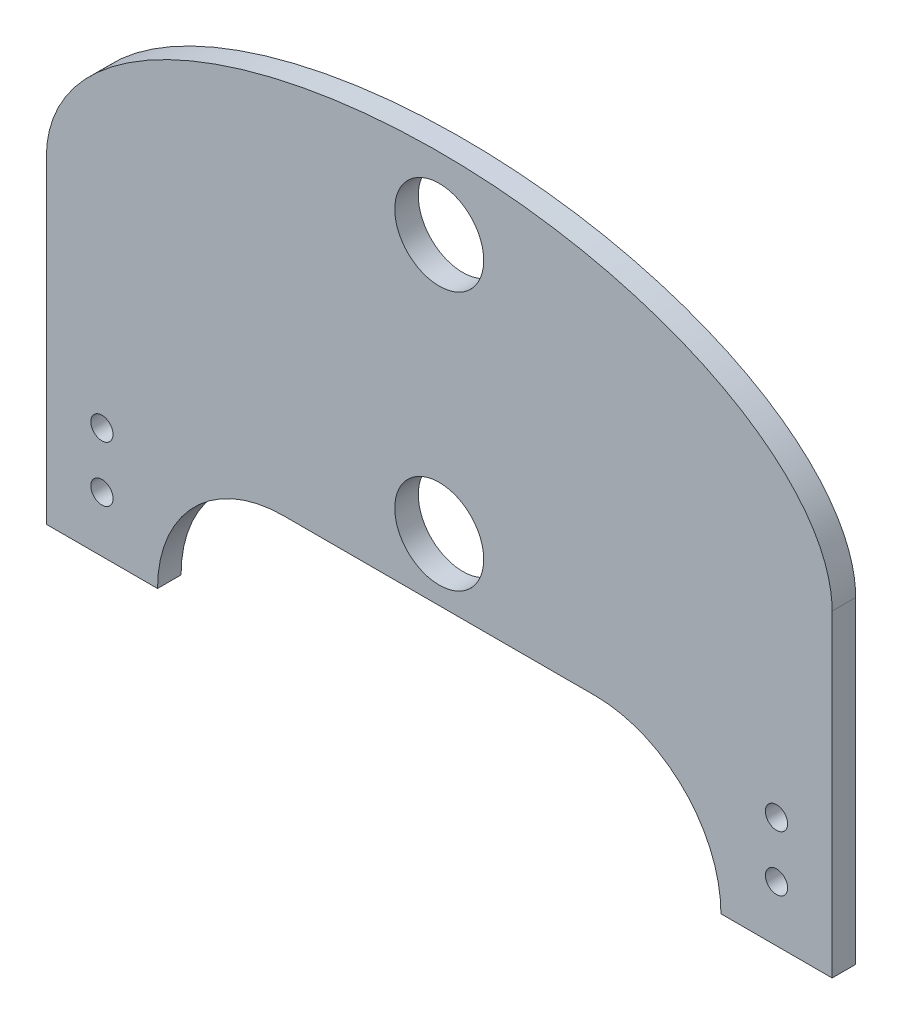
ISO-10303-21;
HEADER;
FILE_DESCRIPTION(('STEP AP214'),'2;1');
FILE_NAME('part.step','',(''),(''),'','','');
FILE_SCHEMA(('AUTOMOTIVE_DESIGN { 1 0 10303 214 1 1 1 1 }'));
ENDSEC;
DATA;
#1=APPLICATION_CONTEXT('core data for automotive mechanical design processes');
#2=APPLICATION_PROTOCOL_DEFINITION('international standard','automotive_design',2000,#1);
#3=PRODUCT_CONTEXT('',#1,'mechanical');
#4=PRODUCT('Part','Part','',(#3));
#5=PRODUCT_RELATED_PRODUCT_CATEGORY('part','',(#4));
#6=PRODUCT_DEFINITION_FORMATION('','',#4);
#7=PRODUCT_DEFINITION_CONTEXT('part definition',#1,'design');
#8=PRODUCT_DEFINITION('design','',#6,#7);
#9=PRODUCT_DEFINITION_SHAPE('','',#8);
#10=(LENGTH_UNIT() NAMED_UNIT(*) SI_UNIT(.MILLI.,.METRE.));
#11=(NAMED_UNIT(*) PLANE_ANGLE_UNIT() SI_UNIT($,.RADIAN.));
#12=(NAMED_UNIT(*) SI_UNIT($,.STERADIAN.) SOLID_ANGLE_UNIT());
#13=UNCERTAINTY_MEASURE_WITH_UNIT(LENGTH_MEASURE(1.E-05),#10,'distance_accuracy_value','');
#14=(GEOMETRIC_REPRESENTATION_CONTEXT(3) GLOBAL_UNCERTAINTY_ASSIGNED_CONTEXT((#13)) GLOBAL_UNIT_ASSIGNED_CONTEXT((#10,
#11,#12)) REPRESENTATION_CONTEXT('',''));
#15=CARTESIAN_POINT('',(0.,0.,0.));
#16=DIRECTION('',(0.,0.,1.));
#17=DIRECTION('',(1.,0.,0.));
#18=AXIS2_PLACEMENT_3D('',#15,#16,#17);
#19=CARTESIAN_POINT('',(0.,0.,3.175));
#20=DIRECTION('',(0.,0.,1.));
#21=DIRECTION('',(1.,0.,0.));
#22=AXIS2_PLACEMENT_3D('',#19,#20,#21);
#23=PLANE('',#22);
#24=CARTESIAN_POINT('',(7.5,7.5,3.175));
#25=DIRECTION('',(0.,0.,-1.));
#26=DIRECTION('',(-1.,0.,0.));
#27=AXIS2_PLACEMENT_3D('',#24,#25,#26);
#28=CIRCLE('',#27,1.5);
#29=CARTESIAN_POINT('',(6.,7.5,3.175));
#30=VERTEX_POINT('',#29);
#31=EDGE_CURVE('E232',#30,#30,#28,.T.);
#32=ORIENTED_EDGE('',*,*,#31,.T.);
#33=EDGE_LOOP('',(#32));
#34=FACE_BOUND('',#33,.T.);
#35=CARTESIAN_POINT('',(7.5,15.,3.175));
#36=DIRECTION('',(0.,0.,-1.));
#37=DIRECTION('',(-1.,0.,0.));
#38=AXIS2_PLACEMENT_3D('',#35,#36,#37);
#39=CIRCLE('',#38,1.5);
#40=CARTESIAN_POINT('',(6.,15.,3.175));
#41=VERTEX_POINT('',#40);
#42=EDGE_CURVE('E224',#41,#41,#39,.T.);
#43=ORIENTED_EDGE('',*,*,#42,.T.);
#44=EDGE_LOOP('',(#43));
#45=FACE_BOUND('',#44,.T.);
#46=CARTESIAN_POINT('',(98.5,15.,3.175));
#47=DIRECTION('',(0.,0.,-1.));
#48=DIRECTION('',(-1.,0.,0.));
#49=AXIS2_PLACEMENT_3D('',#46,#47,#48);
#50=CIRCLE('',#49,1.5);
#51=CARTESIAN_POINT('',(97.,15.,3.175));
#52=VERTEX_POINT('',#51);
#53=EDGE_CURVE('E215',#52,#52,#50,.T.);
#54=ORIENTED_EDGE('',*,*,#53,.T.);
#55=EDGE_LOOP('',(#54));
#56=FACE_BOUND('',#55,.T.);
#57=CARTESIAN_POINT('',(98.5,7.5,3.175));
#58=DIRECTION('',(0.,0.,-1.));
#59=DIRECTION('',(-1.,0.,0.));
#60=AXIS2_PLACEMENT_3D('',#57,#58,#59);
#61=CIRCLE('',#60,1.5);
#62=CARTESIAN_POINT('',(97.,7.5,3.175));
#63=VERTEX_POINT('',#62);
#64=EDGE_CURVE('E154',#63,#63,#61,.T.);
#65=ORIENTED_EDGE('',*,*,#64,.T.);
#66=EDGE_LOOP('',(#65));
#67=FACE_BOUND('',#66,.T.);
#68=CARTESIAN_POINT('',(53.,25.4,3.175));
#69=DIRECTION('',(0.,0.,1.));
#70=DIRECTION('',(1.,0.,0.));
#71=AXIS2_PLACEMENT_3D('',#68,#69,#70);
#72=CIRCLE('',#71,5.99999999999999);
#73=CARTESIAN_POINT('',(59.,25.4,3.175));
#74=VERTEX_POINT('',#73);
#75=EDGE_CURVE('E141',#74,#74,#72,.T.);
#76=ORIENTED_EDGE('',*,*,#75,.F.);
#77=EDGE_LOOP('',(#76));
#78=FACE_BOUND('',#77,.T.);
#79=CARTESIAN_POINT('',(53.,60.325,3.175));
#80=DIRECTION('',(0.,0.,1.));
#81=DIRECTION('',(1.,0.,0.));
#82=AXIS2_PLACEMENT_3D('',#79,#80,#81);
#83=CIRCLE('',#82,5.99999999999999);
#84=CARTESIAN_POINT('',(59.,60.325,3.175));
#85=VERTEX_POINT('',#84);
#86=EDGE_CURVE('E145',#85,#85,#83,.T.);
#87=ORIENTED_EDGE('',*,*,#86,.F.);
#88=EDGE_LOOP('',(#87));
#89=FACE_BOUND('',#88,.T.);
#90=CARTESIAN_POINT('',(53.,42.8625,3.175));
#91=DIRECTION('',(0.,0.,-1.));
#92=DIRECTION('',(-1.,0.,0.));
#93=AXIS2_PLACEMENT_3D('',#90,#91,#92);
#94=ELLIPSE('',#93,53.,27.1375);
#95=CARTESIAN_POINT('',(0.,42.8625,3.175));
#96=VERTEX_POINT('',#95);
#97=CARTESIAN_POINT('',(106.,42.8625,3.175));
#98=VERTEX_POINT('',#97);
#99=EDGE_CURVE('E203',#96,#98,#94,.T.);
#100=ORIENTED_EDGE('',*,*,#99,.F.);
#101=DIRECTION('',(0.,1.,0.));
#102=VECTOR('',#101,1.);
#103=CARTESIAN_POINT('',(0.,0.,3.175));
#104=LINE('',#103,#102);
#105=CARTESIAN_POINT('',(0.,0.,3.175));
#106=VERTEX_POINT('',#105);
#107=EDGE_CURVE('E134',#106,#96,#104,.T.);
#108=ORIENTED_EDGE('',*,*,#107,.F.);
#109=DIRECTION('',(1.,0.,0.));
#110=VECTOR('',#109,1.);
#111=CARTESIAN_POINT('',(0.,0.,3.175));
#112=LINE('',#111,#110);
#113=CARTESIAN_POINT('',(15.,0.,3.175));
#114=VERTEX_POINT('',#113);
#115=EDGE_CURVE('E66',#106,#114,#112,.T.);
#116=ORIENTED_EDGE('',*,*,#115,.T.);
#117=CARTESIAN_POINT('',(32.,0.,3.175));
#118=DIRECTION('',(0.,0.,1.));
#119=DIRECTION('',(1.,0.,0.));
#120=AXIS2_PLACEMENT_3D('',#117,#118,#119);
#121=CIRCLE('',#120,17.);
#122=CARTESIAN_POINT('',(32.,17.,3.175));
#123=VERTEX_POINT('',#122);
#124=EDGE_CURVE('E180',#123,#114,#121,.T.);
#125=ORIENTED_EDGE('',*,*,#124,.F.);
#126=DIRECTION('',(1.,0.,0.));
#127=VECTOR('',#126,1.);
#128=CARTESIAN_POINT('',(0.,17.,3.175));
#129=LINE('',#128,#127);
#130=CARTESIAN_POINT('',(74.,17.,3.175));
#131=VERTEX_POINT('',#130);
#132=EDGE_CURVE('E247',#123,#131,#129,.T.);
#133=ORIENTED_EDGE('',*,*,#132,.T.);
#134=CARTESIAN_POINT('',(74.,0.,3.175));
#135=DIRECTION('',(0.,0.,1.));
#136=DIRECTION('',(1.,0.,0.));
#137=AXIS2_PLACEMENT_3D('',#134,#135,#136);
#138=CIRCLE('',#137,17.);
#139=CARTESIAN_POINT('',(91.,0.,3.175));
#140=VERTEX_POINT('',#139);
#141=EDGE_CURVE('E116',#140,#131,#138,.T.);
#142=ORIENTED_EDGE('',*,*,#141,.F.);
#143=CARTESIAN_POINT('',(106.,0.,3.175));
#144=VERTEX_POINT('',#143);
#145=EDGE_CURVE('E110',#140,#144,#112,.T.);
#146=ORIENTED_EDGE('',*,*,#145,.T.);
#147=DIRECTION('',(0.,1.,0.));
#148=VECTOR('',#147,1.);
#149=CARTESIAN_POINT('',(106.,0.,3.175));
#150=LINE('',#149,#148);
#151=EDGE_CURVE('E114',#144,#98,#150,.T.);
#152=ORIENTED_EDGE('',*,*,#151,.T.);
#153=EDGE_LOOP('',(#100,#108,#116,#125,#133,#142,#146,#152));
#154=FACE_BOUND('',#153,.T.);
#155=ADVANCED_FACE('F41',(#34,#45,#56,#67,#78,#89,#154),#23,.T.);
#156=CARTESIAN_POINT('',(0.,0.,0.));
#157=DIRECTION('',(0.,0.,1.));
#158=DIRECTION('',(1.,0.,0.));
#159=AXIS2_PLACEMENT_3D('',#156,#157,#158);
#160=PLANE('',#159);
#161=CARTESIAN_POINT('',(7.5,7.5,0.));
#162=DIRECTION('',(0.,0.,-1.));
#163=DIRECTION('',(-1.,0.,0.));
#164=AXIS2_PLACEMENT_3D('',#161,#162,#163);
#165=CIRCLE('',#164,1.5);
#166=CARTESIAN_POINT('',(6.,7.5,0.));
#167=VERTEX_POINT('',#166);
#168=EDGE_CURVE('E214',#167,#167,#165,.T.);
#169=ORIENTED_EDGE('',*,*,#168,.F.);
#170=EDGE_LOOP('',(#169));
#171=FACE_BOUND('',#170,.T.);
#172=CARTESIAN_POINT('',(7.5,15.,0.));
#173=DIRECTION('',(0.,0.,-1.));
#174=DIRECTION('',(-1.,0.,0.));
#175=AXIS2_PLACEMENT_3D('',#172,#173,#174);
#176=CIRCLE('',#175,1.5);
#177=CARTESIAN_POINT('',(6.,15.,0.));
#178=VERTEX_POINT('',#177);
#179=EDGE_CURVE('E228',#178,#178,#176,.T.);
#180=ORIENTED_EDGE('',*,*,#179,.F.);
#181=EDGE_LOOP('',(#180));
#182=FACE_BOUND('',#181,.T.);
#183=CARTESIAN_POINT('',(98.5,15.,0.));
#184=DIRECTION('',(0.,0.,-1.));
#185=DIRECTION('',(-1.,0.,0.));
#186=AXIS2_PLACEMENT_3D('',#183,#184,#185);
#187=CIRCLE('',#186,1.5);
#188=CARTESIAN_POINT('',(97.,15.,0.));
#189=VERTEX_POINT('',#188);
#190=EDGE_CURVE('E220',#189,#189,#187,.T.);
#191=ORIENTED_EDGE('',*,*,#190,.F.);
#192=EDGE_LOOP('',(#191));
#193=FACE_BOUND('',#192,.T.);
#194=CARTESIAN_POINT('',(98.5,7.5,0.));
#195=DIRECTION('',(0.,0.,-1.));
#196=DIRECTION('',(-1.,0.,0.));
#197=AXIS2_PLACEMENT_3D('',#194,#195,#196);
#198=CIRCLE('',#197,1.5);
#199=CARTESIAN_POINT('',(97.,7.5,0.));
#200=VERTEX_POINT('',#199);
#201=EDGE_CURVE('E219',#200,#200,#198,.T.);
#202=ORIENTED_EDGE('',*,*,#201,.F.);
#203=EDGE_LOOP('',(#202));
#204=FACE_BOUND('',#203,.T.);
#205=CARTESIAN_POINT('',(53.,25.4,0.));
#206=DIRECTION('',(0.,0.,1.));
#207=DIRECTION('',(1.,0.,0.));
#208=AXIS2_PLACEMENT_3D('',#205,#206,#207);
#209=CIRCLE('',#208,5.99999999999999);
#210=CARTESIAN_POINT('',(59.,25.4,0.));
#211=VERTEX_POINT('',#210);
#212=EDGE_CURVE('E172',#211,#211,#209,.T.);
#213=ORIENTED_EDGE('',*,*,#212,.T.);
#214=EDGE_LOOP('',(#213));
#215=FACE_BOUND('',#214,.T.);
#216=CARTESIAN_POINT('',(53.,60.325,0.));
#217=DIRECTION('',(0.,0.,1.));
#218=DIRECTION('',(1.,0.,0.));
#219=AXIS2_PLACEMENT_3D('',#216,#217,#218);
#220=CIRCLE('',#219,5.99999999999999);
#221=CARTESIAN_POINT('',(59.,60.325,0.));
#222=VERTEX_POINT('',#221);
#223=EDGE_CURVE('E176',#222,#222,#220,.T.);
#224=ORIENTED_EDGE('',*,*,#223,.T.);
#225=EDGE_LOOP('',(#224));
#226=FACE_BOUND('',#225,.T.);
#227=DIRECTION('',(0.,1.,0.));
#228=VECTOR('',#227,1.);
#229=CARTESIAN_POINT('',(0.,0.,0.));
#230=LINE('',#229,#228);
#231=CARTESIAN_POINT('',(0.,0.,0.));
#232=VERTEX_POINT('',#231);
#233=CARTESIAN_POINT('',(0.,42.8625,0.));
#234=VERTEX_POINT('',#233);
#235=EDGE_CURVE('E168',#232,#234,#230,.T.);
#236=ORIENTED_EDGE('',*,*,#235,.T.);
#237=CARTESIAN_POINT('',(53.,42.8625,0.));
#238=DIRECTION('',(0.,0.,-1.));
#239=DIRECTION('',(-1.,0.,0.));
#240=AXIS2_PLACEMENT_3D('',#237,#238,#239);
#241=ELLIPSE('',#240,53.,27.1375);
#242=CARTESIAN_POINT('',(106.,42.8625,0.));
#243=VERTEX_POINT('',#242);
#244=EDGE_CURVE('E196',#234,#243,#241,.T.);
#245=ORIENTED_EDGE('',*,*,#244,.T.);
#246=DIRECTION('',(0.,1.,0.));
#247=VECTOR('',#246,1.);
#248=CARTESIAN_POINT('',(106.,0.,0.));
#249=LINE('',#248,#247);
#250=CARTESIAN_POINT('',(106.,0.,0.));
#251=VERTEX_POINT('',#250);
#252=EDGE_CURVE('E164',#251,#243,#249,.T.);
#253=ORIENTED_EDGE('',*,*,#252,.F.);
#254=DIRECTION('',(1.,0.,0.));
#255=VECTOR('',#254,1.);
#256=CARTESIAN_POINT('',(0.,0.,0.));
#257=LINE('',#256,#255);
#258=CARTESIAN_POINT('',(91.,0.,0.));
#259=VERTEX_POINT('',#258);
#260=EDGE_CURVE('E124',#259,#251,#257,.T.);
#261=ORIENTED_EDGE('',*,*,#260,.F.);
#262=CARTESIAN_POINT('',(74.,0.,0.));
#263=DIRECTION('',(0.,0.,1.));
#264=DIRECTION('',(1.,0.,0.));
#265=AXIS2_PLACEMENT_3D('',#262,#263,#264);
#266=CIRCLE('',#265,17.);
#267=CARTESIAN_POINT('',(74.,17.,0.));
#268=VERTEX_POINT('',#267);
#269=EDGE_CURVE('E158',#259,#268,#266,.T.);
#270=ORIENTED_EDGE('',*,*,#269,.T.);
#271=DIRECTION('',(1.,0.,0.));
#272=VECTOR('',#271,1.);
#273=CARTESIAN_POINT('',(0.,17.,0.));
#274=LINE('',#273,#272);
#275=CARTESIAN_POINT('',(32.,17.,0.));
#276=VERTEX_POINT('',#275);
#277=EDGE_CURVE('E153',#276,#268,#274,.T.);
#278=ORIENTED_EDGE('',*,*,#277,.F.);
#279=CARTESIAN_POINT('',(32.,0.,0.));
#280=DIRECTION('',(0.,0.,1.));
#281=DIRECTION('',(1.,0.,0.));
#282=AXIS2_PLACEMENT_3D('',#279,#280,#281);
#283=CIRCLE('',#282,17.);
#284=CARTESIAN_POINT('',(15.,0.,0.));
#285=VERTEX_POINT('',#284);
#286=EDGE_CURVE('E149',#276,#285,#283,.T.);
#287=ORIENTED_EDGE('',*,*,#286,.T.);
#288=EDGE_CURVE('E165',#232,#285,#257,.T.);
#289=ORIENTED_EDGE('',*,*,#288,.F.);
#290=EDGE_LOOP('',(#236,#245,#253,#261,#270,#278,#287,#289));
#291=FACE_BOUND('',#290,.T.);
#292=ADVANCED_FACE('F195',(#171,#182,#193,#204,#215,#226,#291),#160,.F.);
#293=CARTESIAN_POINT('',(0.,0.,3.175));
#294=DIRECTION('',(-1.,0.,0.));
#295=DIRECTION('',(0.,0.,1.));
#296=AXIS2_PLACEMENT_3D('',#293,#294,#295);
#297=PLANE('',#296);
#298=ORIENTED_EDGE('',*,*,#107,.T.);
#299=DIRECTION('',(0.,0.,-1.));
#300=VECTOR('',#299,1.);
#301=CARTESIAN_POINT('',(0.,42.8625,3.175));
#302=LINE('',#301,#300);
#303=EDGE_CURVE('E204',#96,#234,#302,.T.);
#304=ORIENTED_EDGE('',*,*,#303,.T.);
#305=ORIENTED_EDGE('',*,*,#235,.F.);
#306=DIRECTION('',(0.,0.,-1.));
#307=VECTOR('',#306,1.);
#308=CARTESIAN_POINT('',(0.,0.,3.175));
#309=LINE('',#308,#307);
#310=EDGE_CURVE('E130',#106,#232,#309,.T.);
#311=ORIENTED_EDGE('',*,*,#310,.F.);
#312=EDGE_LOOP('',(#298,#304,#305,#311));
#313=FACE_BOUND('',#312,.T.);
#314=ADVANCED_FACE('F258',(#313),#297,.T.);
#315=CARTESIAN_POINT('',(106.,0.,3.175));
#316=DIRECTION('',(-1.,0.,0.));
#317=DIRECTION('',(0.,0.,1.));
#318=AXIS2_PLACEMENT_3D('',#315,#316,#317);
#319=PLANE('',#318);
#320=DIRECTION('',(0.,0.,-1.));
#321=VECTOR('',#320,1.);
#322=CARTESIAN_POINT('',(106.,42.8625,3.175));
#323=LINE('',#322,#321);
#324=EDGE_CURVE('E57',#98,#243,#323,.T.);
#325=ORIENTED_EDGE('',*,*,#324,.F.);
#326=ORIENTED_EDGE('',*,*,#151,.F.);
#327=DIRECTION('',(0.,0.,-1.));
#328=VECTOR('',#327,1.);
#329=CARTESIAN_POINT('',(106.,0.,3.175));
#330=LINE('',#329,#328);
#331=EDGE_CURVE('E121',#144,#251,#330,.T.);
#332=ORIENTED_EDGE('',*,*,#331,.T.);
#333=ORIENTED_EDGE('',*,*,#252,.T.);
#334=EDGE_LOOP('',(#325,#326,#332,#333));
#335=FACE_BOUND('',#334,.T.);
#336=ADVANCED_FACE('F132',(#335),#319,.F.);
#337=CARTESIAN_POINT('',(32.,0.,3.175));
#338=DIRECTION('',(0.,0.,-1.));
#339=DIRECTION('',(-1.,0.,0.));
#340=AXIS2_PLACEMENT_3D('',#337,#338,#339);
#341=CYLINDRICAL_SURFACE('',#340,17.);
#342=ORIENTED_EDGE('',*,*,#286,.F.);
#343=DIRECTION('',(0.,0.,-1.));
#344=VECTOR('',#343,1.);
#345=CARTESIAN_POINT('',(32.,17.,3.175));
#346=LINE('',#345,#344);
#347=EDGE_CURVE('E11',#123,#276,#346,.T.);
#348=ORIENTED_EDGE('',*,*,#347,.F.);
#349=ORIENTED_EDGE('',*,*,#124,.T.);
#350=DIRECTION('',(0.,0.,-1.));
#351=VECTOR('',#350,1.);
#352=CARTESIAN_POINT('',(15.,0.,3.175));
#353=LINE('',#352,#351);
#354=EDGE_CURVE('E93',#114,#285,#353,.T.);
#355=ORIENTED_EDGE('',*,*,#354,.T.);
#356=EDGE_LOOP('',(#342,#348,#349,#355));
#357=FACE_BOUND('',#356,.T.);
#358=ADVANCED_FACE('F43',(#357),#341,.F.);
#359=CARTESIAN_POINT('',(0.,17.,3.175));
#360=DIRECTION('',(0.,1.,0.));
#361=DIRECTION('',(0.,0.,1.));
#362=AXIS2_PLACEMENT_3D('',#359,#360,#361);
#363=PLANE('',#362);
#364=ORIENTED_EDGE('',*,*,#277,.T.);
#365=DIRECTION('',(0.,0.,-1.));
#366=VECTOR('',#365,1.);
#367=CARTESIAN_POINT('',(74.,17.,3.175));
#368=LINE('',#367,#366);
#369=EDGE_CURVE('E50',#131,#268,#368,.T.);
#370=ORIENTED_EDGE('',*,*,#369,.F.);
#371=ORIENTED_EDGE('',*,*,#132,.F.);
#372=ORIENTED_EDGE('',*,*,#347,.T.);
#373=EDGE_LOOP('',(#364,#370,#371,#372));
#374=FACE_BOUND('',#373,.T.);
#375=ADVANCED_FACE('F193',(#374),#363,.F.);
#376=CARTESIAN_POINT('',(74.,0.,3.175));
#377=DIRECTION('',(0.,0.,-1.));
#378=DIRECTION('',(-1.,0.,0.));
#379=AXIS2_PLACEMENT_3D('',#376,#377,#378);
#380=CYLINDRICAL_SURFACE('',#379,17.);
#381=ORIENTED_EDGE('',*,*,#269,.F.);
#382=DIRECTION('',(0.,0.,-1.));
#383=VECTOR('',#382,1.);
#384=CARTESIAN_POINT('',(91.,0.,3.175));
#385=LINE('',#384,#383);
#386=EDGE_CURVE('E129',#140,#259,#385,.T.);
#387=ORIENTED_EDGE('',*,*,#386,.F.);
#388=ORIENTED_EDGE('',*,*,#141,.T.);
#389=ORIENTED_EDGE('',*,*,#369,.T.);
#390=EDGE_LOOP('',(#381,#387,#388,#389));
#391=FACE_BOUND('',#390,.T.);
#392=ADVANCED_FACE('F190',(#391),#380,.F.);
#393=CARTESIAN_POINT('',(0.,0.,3.175));
#394=DIRECTION('',(0.,1.,0.));
#395=DIRECTION('',(0.,0.,1.));
#396=AXIS2_PLACEMENT_3D('',#393,#394,#395);
#397=PLANE('',#396);
#398=ORIENTED_EDGE('',*,*,#260,.T.);
#399=ORIENTED_EDGE('',*,*,#331,.F.);
#400=ORIENTED_EDGE('',*,*,#145,.F.);
#401=ORIENTED_EDGE('',*,*,#386,.T.);
#402=EDGE_LOOP('',(#398,#399,#400,#401));
#403=FACE_BOUND('',#402,.T.);
#404=ADVANCED_FACE('F122',(#403),#397,.F.);
#405=CARTESIAN_POINT('',(53.,25.4,3.175));
#406=DIRECTION('',(0.,0.,-1.));
#407=DIRECTION('',(-1.,0.,0.));
#408=AXIS2_PLACEMENT_3D('',#405,#406,#407);
#409=CYLINDRICAL_SURFACE('',#408,5.99999999999999);
#410=ORIENTED_EDGE('',*,*,#75,.T.);
#411=EDGE_LOOP('',(#410));
#412=FACE_BOUND('',#411,.T.);
#413=ORIENTED_EDGE('',*,*,#212,.F.);
#414=EDGE_LOOP('',(#413));
#415=FACE_BOUND('',#414,.T.);
#416=ADVANCED_FACE('F277',(#412,#415),#409,.F.);
#417=ORIENTED_EDGE('',*,*,#288,.T.);
#418=ORIENTED_EDGE('',*,*,#354,.F.);
#419=ORIENTED_EDGE('',*,*,#115,.F.);
#420=ORIENTED_EDGE('',*,*,#310,.T.);
#421=EDGE_LOOP('',(#417,#418,#419,#420));
#422=FACE_BOUND('',#421,.T.);
#423=ADVANCED_FACE('F252',(#422),#397,.F.);
#424=CARTESIAN_POINT('',(53.,60.325,3.175));
#425=DIRECTION('',(0.,0.,-1.));
#426=DIRECTION('',(-1.,0.,0.));
#427=AXIS2_PLACEMENT_3D('',#424,#425,#426);
#428=CYLINDRICAL_SURFACE('',#427,5.99999999999999);
#429=ORIENTED_EDGE('',*,*,#86,.T.);
#430=EDGE_LOOP('',(#429));
#431=FACE_BOUND('',#430,.T.);
#432=ORIENTED_EDGE('',*,*,#223,.F.);
#433=EDGE_LOOP('',(#432));
#434=FACE_BOUND('',#433,.T.);
#435=ADVANCED_FACE('F273',(#431,#434),#428,.F.);
#436=CARTESIAN_POINT('',(98.5,7.5,3.175));
#437=DIRECTION('',(0.,0.,-1.));
#438=DIRECTION('',(-1.,0.,0.));
#439=AXIS2_PLACEMENT_3D('',#436,#437,#438);
#440=CYLINDRICAL_SURFACE('',#439,1.5);
#441=ORIENTED_EDGE('',*,*,#64,.F.);
#442=EDGE_LOOP('',(#441));
#443=FACE_BOUND('',#442,.T.);
#444=ORIENTED_EDGE('',*,*,#201,.T.);
#445=EDGE_LOOP('',(#444));
#446=FACE_BOUND('',#445,.T.);
#447=ADVANCED_FACE('F270',(#443,#446),#440,.F.);
#448=CARTESIAN_POINT('',(98.5,15.,3.175));
#449=DIRECTION('',(0.,0.,-1.));
#450=DIRECTION('',(-1.,0.,0.));
#451=AXIS2_PLACEMENT_3D('',#448,#449,#450);
#452=CYLINDRICAL_SURFACE('',#451,1.5);
#453=ORIENTED_EDGE('',*,*,#53,.F.);
#454=EDGE_LOOP('',(#453));
#455=FACE_BOUND('',#454,.T.);
#456=ORIENTED_EDGE('',*,*,#190,.T.);
#457=EDGE_LOOP('',(#456));
#458=FACE_BOUND('',#457,.T.);
#459=ADVANCED_FACE('F310',(#455,#458),#452,.F.);
#460=CARTESIAN_POINT('',(7.5,15.,3.175));
#461=DIRECTION('',(0.,0.,-1.));
#462=DIRECTION('',(-1.,0.,0.));
#463=AXIS2_PLACEMENT_3D('',#460,#461,#462);
#464=CYLINDRICAL_SURFACE('',#463,1.5);
#465=ORIENTED_EDGE('',*,*,#42,.F.);
#466=EDGE_LOOP('',(#465));
#467=FACE_BOUND('',#466,.T.);
#468=ORIENTED_EDGE('',*,*,#179,.T.);
#469=EDGE_LOOP('',(#468));
#470=FACE_BOUND('',#469,.T.);
#471=ADVANCED_FACE('F317',(#467,#470),#464,.F.);
#472=CARTESIAN_POINT('',(7.5,7.5,3.175));
#473=DIRECTION('',(0.,0.,-1.));
#474=DIRECTION('',(-1.,0.,0.));
#475=AXIS2_PLACEMENT_3D('',#472,#473,#474);
#476=CYLINDRICAL_SURFACE('',#475,1.5);
#477=ORIENTED_EDGE('',*,*,#31,.F.);
#478=EDGE_LOOP('',(#477));
#479=FACE_BOUND('',#478,.T.);
#480=ORIENTED_EDGE('',*,*,#168,.T.);
#481=EDGE_LOOP('',(#480));
#482=FACE_BOUND('',#481,.T.);
#483=ADVANCED_FACE('F325',(#479,#482),#476,.F.);
#484=DIRECTION('',(0.,0.,-1.));
#485=VECTOR('',#484,1.);
#486=SURFACE_OF_LINEAR_EXTRUSION('',#94,#485);
#487=ORIENTED_EDGE('',*,*,#244,.F.);
#488=ORIENTED_EDGE('',*,*,#303,.F.);
#489=ORIENTED_EDGE('',*,*,#99,.T.);
#490=ORIENTED_EDGE('',*,*,#324,.T.);
#491=EDGE_LOOP('',(#487,#488,#489,#490));
#492=FACE_BOUND('',#491,.T.);
#493=ADVANCED_FACE('F333',(#492),#486,.T.);
#494=CLOSED_SHELL('',(#155,#292,#314,#336,#358,#375,#392,#404,#416,#423,#435,#447,#459,#471,
#483,#493));
#495=MANIFOLD_SOLID_BREP('B2',#494);
#496=ADVANCED_BREP_SHAPE_REPRESENTATION('',(#18,#495),#14);
#497=SHAPE_DEFINITION_REPRESENTATION(#9,#496);
ENDSEC;
END-ISO-10303-21;
